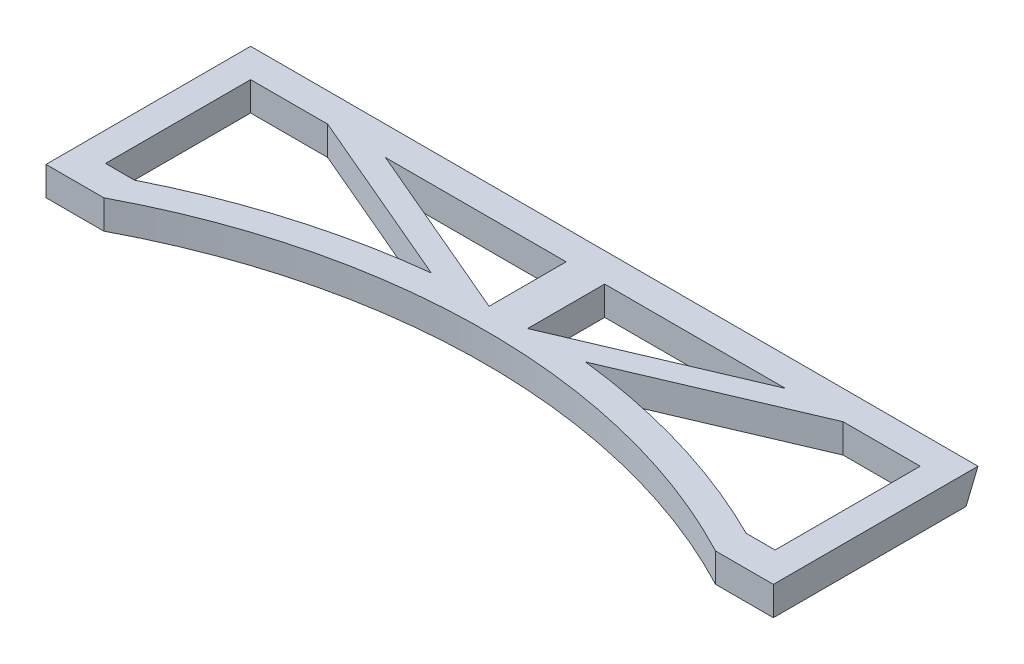
ISO-10303-21;
HEADER;
FILE_DESCRIPTION(('STEP AP214'),'2;1');
FILE_NAME('part.step','',(''),(''),'','','');
FILE_SCHEMA(('AUTOMOTIVE_DESIGN { 1 0 10303 214 1 1 1 1 }'));
ENDSEC;
DATA;
#1=APPLICATION_CONTEXT('core data for automotive mechanical design processes');
#2=APPLICATION_PROTOCOL_DEFINITION('international standard','automotive_design',2000,#1);
#3=PRODUCT_CONTEXT('',#1,'mechanical');
#4=PRODUCT('Part','Part','',(#3));
#5=PRODUCT_RELATED_PRODUCT_CATEGORY('part','',(#4));
#6=PRODUCT_DEFINITION_FORMATION('','',#4);
#7=PRODUCT_DEFINITION_CONTEXT('part definition',#1,'design');
#8=PRODUCT_DEFINITION('design','',#6,#7);
#9=PRODUCT_DEFINITION_SHAPE('','',#8);
#10=(LENGTH_UNIT() NAMED_UNIT(*) SI_UNIT(.MILLI.,.METRE.));
#11=(NAMED_UNIT(*) PLANE_ANGLE_UNIT() SI_UNIT($,.RADIAN.));
#12=(NAMED_UNIT(*) SI_UNIT($,.STERADIAN.) SOLID_ANGLE_UNIT());
#13=UNCERTAINTY_MEASURE_WITH_UNIT(LENGTH_MEASURE(1.E-05),#10,'distance_accuracy_value','');
#14=(GEOMETRIC_REPRESENTATION_CONTEXT(3) GLOBAL_UNCERTAINTY_ASSIGNED_CONTEXT((#13)) GLOBAL_UNIT_ASSIGNED_CONTEXT((#10,
#11,#12)) REPRESENTATION_CONTEXT('',''));
#15=CARTESIAN_POINT('',(0.,0.,0.));
#16=DIRECTION('',(0.,0.,1.));
#17=DIRECTION('',(1.,0.,0.));
#18=AXIS2_PLACEMENT_3D('',#15,#16,#17);
#19=CARTESIAN_POINT('',(0.,9.525,258.356061364937));
#20=DIRECTION('',(0.,-1.,0.));
#21=DIRECTION('',(0.,0.,-1.));
#22=AXIS2_PLACEMENT_3D('',#19,#20,#21);
#23=PLANE('',#22);
#24=DIRECTION('',(0.,0.,1.));
#25=VECTOR('',#24,1.);
#26=CARTESIAN_POINT('',(-119.85625,9.525,0.));
#27=LINE('',#26,#25);
#28=CARTESIAN_POINT('',(-119.85625,9.525,0.));
#29=VERTEX_POINT('',#28);
#30=CARTESIAN_POINT('',(-119.85625,9.525,67.43484735));
#31=VERTEX_POINT('',#30);
#32=EDGE_CURVE('E375',#29,#31,#27,.T.);
#33=ORIENTED_EDGE('',*,*,#32,.T.);
#34=DIRECTION('',(1.,0.,0.));
#35=VECTOR('',#34,1.);
#36=CARTESIAN_POINT('',(-119.85625,9.525,67.43484735));
#37=LINE('',#36,#35);
#38=CARTESIAN_POINT('',(-100.80625,9.525,67.43484735));
#39=VERTEX_POINT('',#38);
#40=EDGE_CURVE('E379',#31,#39,#37,.T.);
#41=ORIENTED_EDGE('',*,*,#40,.T.);
#42=CARTESIAN_POINT('',(0.,9.525,258.356061364937));
#43=DIRECTION('',(0.,-1.,0.));
#44=DIRECTION('',(0.,0.,-1.));
#45=AXIS2_PLACEMENT_3D('',#42,#43,#44);
#46=CIRCLE('',#45,215.9);
#47=CARTESIAN_POINT('',(100.80625,9.525,67.43484735));
#48=VERTEX_POINT('',#47);
#49=EDGE_CURVE('E383',#39,#48,#46,.T.);
#50=ORIENTED_EDGE('',*,*,#49,.T.);
#51=DIRECTION('',(1.,0.,0.));
#52=VECTOR('',#51,1.);
#53=CARTESIAN_POINT('',(119.85625,9.525,67.43484735));
#54=LINE('',#53,#52);
#55=CARTESIAN_POINT('',(119.85625,9.525,67.43484735));
#56=VERTEX_POINT('',#55);
#57=EDGE_CURVE('E386',#48,#56,#54,.T.);
#58=ORIENTED_EDGE('',*,*,#57,.T.);
#59=DIRECTION('',(0.,0.,-1.));
#60=VECTOR('',#59,1.);
#61=CARTESIAN_POINT('',(119.85625,9.525,0.));
#62=LINE('',#61,#60);
#63=CARTESIAN_POINT('',(119.85625,9.525,0.));
#64=VERTEX_POINT('',#63);
#65=EDGE_CURVE('E389',#56,#64,#62,.T.);
#66=ORIENTED_EDGE('',*,*,#65,.T.);
#67=DIRECTION('',(-1.,0.,0.));
#68=VECTOR('',#67,1.);
#69=CARTESIAN_POINT('',(-119.85625,9.525,0.));
#70=LINE('',#69,#68);
#71=EDGE_CURVE('E393',#64,#29,#70,.T.);
#72=ORIENTED_EDGE('',*,*,#71,.T.);
#73=EDGE_LOOP('',(#33,#41,#50,#58,#66,#72));
#74=FACE_BOUND('',#73,.T.);
#75=CARTESIAN_POINT('',(0.,9.525,258.356061364937));
#76=DIRECTION('',(0.,-1.,0.));
#77=DIRECTION('',(0.,0.,-1.));
#78=AXIS2_PLACEMENT_3D('',#75,#76,#77);
#79=CIRCLE('',#78,224.870182955994);
#80=CARTESIAN_POINT('',(-100.80625,9.525,57.3468597258087));
#81=VERTEX_POINT('',#80);
#82=CARTESIAN_POINT('',(-25.4,9.525,34.925));
#83=VERTEX_POINT('',#82);
#84=EDGE_CURVE('E344',#81,#83,#79,.T.);
#85=ORIENTED_EDGE('',*,*,#84,.F.);
#86=DIRECTION('',(1.,0.,0.));
#87=VECTOR('',#86,1.);
#88=CARTESIAN_POINT('',(-110.33125,9.525,57.3468597258086));
#89=LINE('',#88,#87);
#90=CARTESIAN_POINT('',(-110.33125,9.525,57.3468597258086));
#91=VERTEX_POINT('',#90);
#92=EDGE_CURVE('E274',#91,#81,#89,.T.);
#93=ORIENTED_EDGE('',*,*,#92,.F.);
#94=DIRECTION('',(0.,0.,1.));
#95=VECTOR('',#94,1.);
#96=CARTESIAN_POINT('',(-110.33125,9.525,57.3468597258086));
#97=LINE('',#96,#95);
#98=CARTESIAN_POINT('',(-110.33125,9.525,9.52499999999996));
#99=VERTEX_POINT('',#98);
#100=EDGE_CURVE('E325',#99,#91,#97,.T.);
#101=ORIENTED_EDGE('',*,*,#100,.F.);
#102=DIRECTION('',(-1.,0.,0.));
#103=VECTOR('',#102,1.);
#104=CARTESIAN_POINT('',(-110.33125,9.525,9.52499999999996));
#105=LINE('',#104,#103);
#106=CARTESIAN_POINT('',(-84.93125,9.525,9.52499999999996));
#107=VERTEX_POINT('',#106);
#108=EDGE_CURVE('E352',#107,#99,#105,.T.);
#109=ORIENTED_EDGE('',*,*,#108,.F.);
#110=DIRECTION('',(-0.919778168080743,0.,-0.392438685047784));
#111=VECTOR('',#110,1.);
#112=CARTESIAN_POINT('',(-84.93125,9.525,9.52499999999996));
#113=LINE('',#112,#111);
#114=EDGE_CURVE('E348',#83,#107,#113,.T.);
#115=ORIENTED_EDGE('',*,*,#114,.F.);
#116=EDGE_LOOP('',(#85,#93,#101,#109,#115));
#117=FACE_BOUND('',#116,.T.);
#118=DIRECTION('',(0.919778168080742,0.,-0.392438685047784));
#119=VECTOR('',#118,1.);
#120=CARTESIAN_POINT('',(65.88125,9.525,9.52499999999995));
#121=LINE('',#120,#119);
#122=CARTESIAN_POINT('',(6.35000000000001,9.525,34.925));
#123=VERTEX_POINT('',#122);
#124=CARTESIAN_POINT('',(65.88125,9.525,9.52499999999995));
#125=VERTEX_POINT('',#124);
#126=EDGE_CURVE('E217',#123,#125,#121,.T.);
#127=ORIENTED_EDGE('',*,*,#126,.F.);
#128=DIRECTION('',(0.,0.,1.));
#129=VECTOR('',#128,1.);
#130=CARTESIAN_POINT('',(6.35,9.525,34.925));
#131=LINE('',#130,#129);
#132=CARTESIAN_POINT('',(6.35,9.525,9.52499999999996));
#133=VERTEX_POINT('',#132);
#134=EDGE_CURVE('E200',#133,#123,#131,.T.);
#135=ORIENTED_EDGE('',*,*,#134,.F.);
#136=DIRECTION('',(-1.,0.,0.));
#137=VECTOR('',#136,1.);
#138=CARTESIAN_POINT('',(6.35,9.525,9.52499999999996));
#139=LINE('',#138,#137);
#140=EDGE_CURVE('E210',#125,#133,#139,.T.);
#141=ORIENTED_EDGE('',*,*,#140,.F.);
#142=EDGE_LOOP('',(#127,#135,#141));
#143=FACE_BOUND('',#142,.T.);
#144=DIRECTION('',(0.919778168080742,0.,0.392438685047783));
#145=VECTOR('',#144,1.);
#146=CARTESIAN_POINT('',(-65.88125,9.525,9.52499999999996));
#147=LINE('',#146,#145);
#148=CARTESIAN_POINT('',(-65.88125,9.525,9.52499999999996));
#149=VERTEX_POINT('',#148);
#150=CARTESIAN_POINT('',(-6.35,9.525,34.925));
#151=VERTEX_POINT('',#150);
#152=EDGE_CURVE('E303',#149,#151,#147,.T.);
#153=ORIENTED_EDGE('',*,*,#152,.F.);
#154=DIRECTION('',(-1.,0.,0.));
#155=VECTOR('',#154,1.);
#156=CARTESIAN_POINT('',(-6.34999999999999,9.525,9.52499999999996));
#157=LINE('',#156,#155);
#158=CARTESIAN_POINT('',(-6.34999999999999,9.525,9.52499999999996));
#159=VERTEX_POINT('',#158);
#160=EDGE_CURVE('E72',#159,#149,#157,.T.);
#161=ORIENTED_EDGE('',*,*,#160,.F.);
#162=DIRECTION('',(0.,0.,-1.));
#163=VECTOR('',#162,1.);
#164=CARTESIAN_POINT('',(-6.35,9.525,34.925));
#165=LINE('',#164,#163);
#166=EDGE_CURVE('E299',#151,#159,#165,.T.);
#167=ORIENTED_EDGE('',*,*,#166,.F.);
#168=EDGE_LOOP('',(#153,#161,#167));
#169=FACE_BOUND('',#168,.T.);
#170=DIRECTION('',(1.,0.,0.));
#171=VECTOR('',#170,1.);
#172=CARTESIAN_POINT('',(110.33125,9.525,57.3468597258086));
#173=LINE('',#172,#171);
#174=CARTESIAN_POINT('',(100.80625,9.525,57.3468597258086));
#175=VERTEX_POINT('',#174);
#176=CARTESIAN_POINT('',(110.33125,9.525,57.3468597258086));
#177=VERTEX_POINT('',#176);
#178=EDGE_CURVE('E268',#175,#177,#173,.T.);
#179=ORIENTED_EDGE('',*,*,#178,.F.);
#180=CARTESIAN_POINT('',(0.,9.525,258.356061364937));
#181=DIRECTION('',(0.,-1.,0.));
#182=DIRECTION('',(0.,0.,1.));
#183=AXIS2_PLACEMENT_3D('',#180,#181,#182);
#184=CIRCLE('',#183,224.870182955994);
#185=CARTESIAN_POINT('',(25.4,9.525,34.9249999999999));
#186=VERTEX_POINT('',#185);
#187=EDGE_CURVE('E64',#186,#175,#184,.T.);
#188=ORIENTED_EDGE('',*,*,#187,.F.);
#189=DIRECTION('',(-0.919778168080742,0.,0.392438685047784));
#190=VECTOR('',#189,1.);
#191=CARTESIAN_POINT('',(84.93125,9.525,9.52499999999994));
#192=LINE('',#191,#190);
#193=CARTESIAN_POINT('',(84.93125,9.525,9.52499999999994));
#194=VERTEX_POINT('',#193);
#195=EDGE_CURVE('E255',#194,#186,#192,.T.);
#196=ORIENTED_EDGE('',*,*,#195,.F.);
#197=DIRECTION('',(-1.,0.,0.));
#198=VECTOR('',#197,1.);
#199=CARTESIAN_POINT('',(110.33125,9.525,9.52499999999995));
#200=LINE('',#199,#198);
#201=CARTESIAN_POINT('',(110.33125,9.525,9.52499999999995));
#202=VERTEX_POINT('',#201);
#203=EDGE_CURVE('E259',#202,#194,#200,.T.);
#204=ORIENTED_EDGE('',*,*,#203,.F.);
#205=DIRECTION('',(0.,0.,-1.));
#206=VECTOR('',#205,1.);
#207=CARTESIAN_POINT('',(110.33125,9.525,57.3468597258086));
#208=LINE('',#207,#206);
#209=EDGE_CURVE('E264',#177,#202,#208,.T.);
#210=ORIENTED_EDGE('',*,*,#209,.F.);
#211=EDGE_LOOP('',(#179,#188,#196,#204,#210));
#212=FACE_BOUND('',#211,.T.);
#213=ADVANCED_FACE('F47',(#74,#117,#143,#169,#212),#23,.F.);
#214=CARTESIAN_POINT('',(0.,0.,258.356061364937));
#215=DIRECTION('',(0.,-1.,0.));
#216=DIRECTION('',(0.,0.,-1.));
#217=AXIS2_PLACEMENT_3D('',#214,#215,#216);
#218=PLANE('',#217);
#219=DIRECTION('',(-1.,0.,0.));
#220=VECTOR('',#219,1.);
#221=CARTESIAN_POINT('',(-6.34999999999999,0.,9.52499999999996));
#222=LINE('',#221,#220);
#223=CARTESIAN_POINT('',(-6.34999999999999,0.,9.52499999999996));
#224=VERTEX_POINT('',#223);
#225=CARTESIAN_POINT('',(-65.88125,0.,9.52499999999996));
#226=VERTEX_POINT('',#225);
#227=EDGE_CURVE('E304',#224,#226,#222,.T.);
#228=ORIENTED_EDGE('',*,*,#227,.T.);
#229=DIRECTION('',(0.919778168080742,0.,0.392438685047783));
#230=VECTOR('',#229,1.);
#231=CARTESIAN_POINT('',(-65.88125,0.,9.52499999999996));
#232=LINE('',#231,#230);
#233=CARTESIAN_POINT('',(-6.34999999999999,0.,34.9249999999999));
#234=VERTEX_POINT('',#233);
#235=EDGE_CURVE('E313',#226,#234,#232,.T.);
#236=ORIENTED_EDGE('',*,*,#235,.T.);
#237=DIRECTION('',(0.,0.,-1.));
#238=VECTOR('',#237,1.);
#239=CARTESIAN_POINT('',(-6.35,0.,34.925));
#240=LINE('',#239,#238);
#241=EDGE_CURVE('E296',#234,#224,#240,.T.);
#242=ORIENTED_EDGE('',*,*,#241,.T.);
#243=EDGE_LOOP('',(#228,#236,#242));
#244=FACE_BOUND('',#243,.T.);
#245=DIRECTION('',(1.,0.,0.));
#246=VECTOR('',#245,1.);
#247=CARTESIAN_POINT('',(-110.33125,0.,57.3468597258086));
#248=LINE('',#247,#246);
#249=CARTESIAN_POINT('',(-110.33125,0.,57.3468597258086));
#250=VERTEX_POINT('',#249);
#251=CARTESIAN_POINT('',(-100.80625,0.,57.3468597258087));
#252=VERTEX_POINT('',#251);
#253=EDGE_CURVE('E320',#250,#252,#248,.T.);
#254=ORIENTED_EDGE('',*,*,#253,.T.);
#255=CARTESIAN_POINT('',(0.,0.,258.356061364937));
#256=DIRECTION('',(0.,-1.,0.));
#257=DIRECTION('',(0.,0.,-1.));
#258=AXIS2_PLACEMENT_3D('',#255,#256,#257);
#259=CIRCLE('',#258,224.870182955994);
#260=CARTESIAN_POINT('',(-25.4,0.,34.925));
#261=VERTEX_POINT('',#260);
#262=EDGE_CURVE('E324',#252,#261,#259,.T.);
#263=ORIENTED_EDGE('',*,*,#262,.T.);
#264=DIRECTION('',(-0.919778168080743,0.,-0.392438685047784));
#265=VECTOR('',#264,1.);
#266=CARTESIAN_POINT('',(-84.93125,0.,9.52499999999996));
#267=LINE('',#266,#265);
#268=CARTESIAN_POINT('',(-84.93125,0.,9.52499999999996));
#269=VERTEX_POINT('',#268);
#270=EDGE_CURVE('E329',#261,#269,#267,.T.);
#271=ORIENTED_EDGE('',*,*,#270,.T.);
#272=DIRECTION('',(-1.,0.,0.));
#273=VECTOR('',#272,1.);
#274=CARTESIAN_POINT('',(-110.33125,0.,9.52499999999996));
#275=LINE('',#274,#273);
#276=CARTESIAN_POINT('',(-110.33125,0.,9.52499999999996));
#277=VERTEX_POINT('',#276);
#278=EDGE_CURVE('E333',#269,#277,#275,.T.);
#279=ORIENTED_EDGE('',*,*,#278,.T.);
#280=DIRECTION('',(0.,0.,1.));
#281=VECTOR('',#280,1.);
#282=CARTESIAN_POINT('',(-110.33125,0.,57.3468597258086));
#283=LINE('',#282,#281);
#284=EDGE_CURVE('E337',#277,#250,#283,.T.);
#285=ORIENTED_EDGE('',*,*,#284,.T.);
#286=EDGE_LOOP('',(#254,#263,#271,#279,#285));
#287=FACE_BOUND('',#286,.T.);
#288=DIRECTION('',(0.,0.,1.));
#289=VECTOR('',#288,1.);
#290=CARTESIAN_POINT('',(-119.85625,0.,0.));
#291=LINE('',#290,#289);
#292=CARTESIAN_POINT('',(-119.85625,0.,3.93484735000001));
#293=VERTEX_POINT('',#292);
#294=CARTESIAN_POINT('',(-119.85625,0.,67.43484735));
#295=VERTEX_POINT('',#294);
#296=EDGE_CURVE('E362',#293,#295,#291,.T.);
#297=ORIENTED_EDGE('',*,*,#296,.F.);
#298=DIRECTION('',(1.,0.,0.));
#299=VECTOR('',#298,1.);
#300=CARTESIAN_POINT('',(119.85625,0.,3.93484734999997));
#301=LINE('',#300,#299);
#302=CARTESIAN_POINT('',(119.85625,0.,3.93484734999997));
#303=VERTEX_POINT('',#302);
#304=EDGE_CURVE('E57',#293,#303,#301,.T.);
#305=ORIENTED_EDGE('',*,*,#304,.T.);
#306=DIRECTION('',(0.,0.,-1.));
#307=VECTOR('',#306,1.);
#308=CARTESIAN_POINT('',(119.85625,0.,0.));
#309=LINE('',#308,#307);
#310=CARTESIAN_POINT('',(119.85625,0.,67.43484735));
#311=VERTEX_POINT('',#310);
#312=EDGE_CURVE('E380',#311,#303,#309,.T.);
#313=ORIENTED_EDGE('',*,*,#312,.F.);
#314=DIRECTION('',(1.,0.,0.));
#315=VECTOR('',#314,1.);
#316=CARTESIAN_POINT('',(119.85625,0.,67.43484735));
#317=LINE('',#316,#315);
#318=CARTESIAN_POINT('',(100.80625,0.,67.43484735));
#319=VERTEX_POINT('',#318);
#320=EDGE_CURVE('E406',#319,#311,#317,.T.);
#321=ORIENTED_EDGE('',*,*,#320,.F.);
#322=CARTESIAN_POINT('',(0.,0.,258.356061364937));
#323=DIRECTION('',(0.,-1.,0.));
#324=DIRECTION('',(0.,0.,-1.));
#325=AXIS2_PLACEMENT_3D('',#322,#323,#324);
#326=CIRCLE('',#325,215.9);
#327=CARTESIAN_POINT('',(-100.80625,0.,67.43484735));
#328=VERTEX_POINT('',#327);
#329=EDGE_CURVE('E403',#328,#319,#326,.T.);
#330=ORIENTED_EDGE('',*,*,#329,.F.);
#331=DIRECTION('',(1.,0.,0.));
#332=VECTOR('',#331,1.);
#333=CARTESIAN_POINT('',(-119.85625,0.,67.43484735));
#334=LINE('',#333,#332);
#335=EDGE_CURVE('E400',#295,#328,#334,.T.);
#336=ORIENTED_EDGE('',*,*,#335,.F.);
#337=EDGE_LOOP('',(#297,#305,#313,#321,#330,#336));
#338=FACE_BOUND('',#337,.T.);
#339=DIRECTION('',(0.,0.,1.));
#340=VECTOR('',#339,1.);
#341=CARTESIAN_POINT('',(6.35,0.,34.925));
#342=LINE('',#341,#340);
#343=CARTESIAN_POINT('',(6.35,0.,9.52499999999996));
#344=VERTEX_POINT('',#343);
#345=CARTESIAN_POINT('',(6.35,0.,34.925));
#346=VERTEX_POINT('',#345);
#347=EDGE_CURVE('E203',#344,#346,#342,.T.);
#348=ORIENTED_EDGE('',*,*,#347,.T.);
#349=DIRECTION('',(0.919778168080742,0.,-0.392438685047784));
#350=VECTOR('',#349,1.);
#351=CARTESIAN_POINT('',(65.88125,0.,9.52499999999995));
#352=LINE('',#351,#350);
#353=CARTESIAN_POINT('',(65.88125,0.,9.52499999999996));
#354=VERTEX_POINT('',#353);
#355=EDGE_CURVE('E232',#346,#354,#352,.T.);
#356=ORIENTED_EDGE('',*,*,#355,.T.);
#357=DIRECTION('',(-1.,0.,0.));
#358=VECTOR('',#357,1.);
#359=CARTESIAN_POINT('',(6.35,0.,9.52499999999996));
#360=LINE('',#359,#358);
#361=EDGE_CURVE('E229',#354,#344,#360,.T.);
#362=ORIENTED_EDGE('',*,*,#361,.T.);
#363=EDGE_LOOP('',(#348,#356,#362));
#364=FACE_BOUND('',#363,.T.);
#365=CARTESIAN_POINT('',(0.,0.,258.356061364937));
#366=DIRECTION('',(0.,-1.,0.));
#367=DIRECTION('',(0.,0.,1.));
#368=AXIS2_PLACEMENT_3D('',#365,#366,#367);
#369=CIRCLE('',#368,224.870182955994);
#370=CARTESIAN_POINT('',(25.4,0.,34.9249999999999));
#371=VERTEX_POINT('',#370);
#372=CARTESIAN_POINT('',(100.80625,0.,57.3468597258086));
#373=VERTEX_POINT('',#372);
#374=EDGE_CURVE('E260',#371,#373,#369,.T.);
#375=ORIENTED_EDGE('',*,*,#374,.T.);
#376=DIRECTION('',(1.,0.,0.));
#377=VECTOR('',#376,1.);
#378=CARTESIAN_POINT('',(110.33125,0.,57.3468597258086));
#379=LINE('',#378,#377);
#380=CARTESIAN_POINT('',(110.33125,0.,57.3468597258086));
#381=VERTEX_POINT('',#380);
#382=EDGE_CURVE('E286',#373,#381,#379,.T.);
#383=ORIENTED_EDGE('',*,*,#382,.T.);
#384=DIRECTION('',(0.,0.,-1.));
#385=VECTOR('',#384,1.);
#386=CARTESIAN_POINT('',(110.33125,0.,57.3468597258086));
#387=LINE('',#386,#385);
#388=CARTESIAN_POINT('',(110.33125,0.,9.52499999999995));
#389=VERTEX_POINT('',#388);
#390=EDGE_CURVE('E282',#381,#389,#387,.T.);
#391=ORIENTED_EDGE('',*,*,#390,.T.);
#392=DIRECTION('',(-1.,0.,0.));
#393=VECTOR('',#392,1.);
#394=CARTESIAN_POINT('',(110.33125,0.,9.52499999999995));
#395=LINE('',#394,#393);
#396=CARTESIAN_POINT('',(84.93125,0.,9.52499999999994));
#397=VERTEX_POINT('',#396);
#398=EDGE_CURVE('E278',#389,#397,#395,.T.);
#399=ORIENTED_EDGE('',*,*,#398,.T.);
#400=DIRECTION('',(-0.919778168080742,0.,0.392438685047784));
#401=VECTOR('',#400,1.);
#402=CARTESIAN_POINT('',(84.93125,0.,9.52499999999994));
#403=LINE('',#402,#401);
#404=EDGE_CURVE('E242',#397,#371,#403,.T.);
#405=ORIENTED_EDGE('',*,*,#404,.T.);
#406=EDGE_LOOP('',(#375,#383,#391,#399,#405));
#407=FACE_BOUND('',#406,.T.);
#408=ADVANCED_FACE('F434',(#244,#287,#338,#364,#407),#218,.T.);
#409=CARTESIAN_POINT('',(-119.85625,9.525,0.));
#410=DIRECTION('',(1.,0.,0.));
#411=DIRECTION('',(0.,0.,-1.));
#412=AXIS2_PLACEMENT_3D('',#409,#410,#411);
#413=PLANE('',#412);
#414=ORIENTED_EDGE('',*,*,#32,.F.);
#415=DIRECTION('',(0.,-0.924240601032716,0.38181057005102));
#416=VECTOR('',#415,1.);
#417=CARTESIAN_POINT('',(-119.85625,9.52500000000009,0.));
#418=LINE('',#417,#416);
#419=EDGE_CURVE('E427',#29,#293,#418,.T.);
#420=ORIENTED_EDGE('',*,*,#419,.T.);
#421=ORIENTED_EDGE('',*,*,#296,.T.);
#422=DIRECTION('',(0.,-1.,0.));
#423=VECTOR('',#422,1.);
#424=CARTESIAN_POINT('',(-119.85625,9.525,67.43484735));
#425=LINE('',#424,#423);
#426=EDGE_CURVE('E423',#31,#295,#425,.T.);
#427=ORIENTED_EDGE('',*,*,#426,.F.);
#428=EDGE_LOOP('',(#414,#420,#421,#427));
#429=FACE_BOUND('',#428,.T.);
#430=ADVANCED_FACE('F450',(#429),#413,.F.);
#431=CARTESIAN_POINT('',(-119.85625,9.525,67.43484735));
#432=DIRECTION('',(0.,0.,-1.));
#433=DIRECTION('',(-1.,0.,0.));
#434=AXIS2_PLACEMENT_3D('',#431,#432,#433);
#435=PLANE('',#434);
#436=ORIENTED_EDGE('',*,*,#335,.T.);
#437=DIRECTION('',(0.,-1.,0.));
#438=VECTOR('',#437,1.);
#439=CARTESIAN_POINT('',(-100.80625,9.525,67.43484735));
#440=LINE('',#439,#438);
#441=EDGE_CURVE('E419',#39,#328,#440,.T.);
#442=ORIENTED_EDGE('',*,*,#441,.F.);
#443=ORIENTED_EDGE('',*,*,#40,.F.);
#444=ORIENTED_EDGE('',*,*,#426,.T.);
#445=EDGE_LOOP('',(#436,#442,#443,#444));
#446=FACE_BOUND('',#445,.T.);
#447=ADVANCED_FACE('F452',(#446),#435,.F.);
#448=CARTESIAN_POINT('',(0.,9.525,258.356061364937));
#449=DIRECTION('',(0.,-1.,0.));
#450=DIRECTION('',(0.,0.,-1.));
#451=AXIS2_PLACEMENT_3D('',#448,#449,#450);
#452=CYLINDRICAL_SURFACE('',#451,215.9);
#453=ORIENTED_EDGE('',*,*,#329,.T.);
#454=DIRECTION('',(0.,-1.,0.));
#455=VECTOR('',#454,1.);
#456=CARTESIAN_POINT('',(100.80625,9.525,67.43484735));
#457=LINE('',#456,#455);
#458=EDGE_CURVE('E415',#48,#319,#457,.T.);
#459=ORIENTED_EDGE('',*,*,#458,.F.);
#460=ORIENTED_EDGE('',*,*,#49,.F.);
#461=ORIENTED_EDGE('',*,*,#441,.T.);
#462=EDGE_LOOP('',(#453,#459,#460,#461));
#463=FACE_BOUND('',#462,.T.);
#464=ADVANCED_FACE('F458',(#463),#452,.F.);
#465=CARTESIAN_POINT('',(119.85625,9.525,67.43484735));
#466=DIRECTION('',(0.,0.,-1.));
#467=DIRECTION('',(-1.,0.,0.));
#468=AXIS2_PLACEMENT_3D('',#465,#466,#467);
#469=PLANE('',#468);
#470=ORIENTED_EDGE('',*,*,#320,.T.);
#471=DIRECTION('',(0.,-1.,0.));
#472=VECTOR('',#471,1.);
#473=CARTESIAN_POINT('',(119.85625,9.525,67.43484735));
#474=LINE('',#473,#472);
#475=EDGE_CURVE('E397',#56,#311,#474,.T.);
#476=ORIENTED_EDGE('',*,*,#475,.F.);
#477=ORIENTED_EDGE('',*,*,#57,.F.);
#478=ORIENTED_EDGE('',*,*,#458,.T.);
#479=EDGE_LOOP('',(#470,#476,#477,#478));
#480=FACE_BOUND('',#479,.T.);
#481=ADVANCED_FACE('F461',(#480),#469,.F.);
#482=CARTESIAN_POINT('',(119.85625,9.525,0.));
#483=DIRECTION('',(-1.,0.,0.));
#484=DIRECTION('',(0.,0.,1.));
#485=AXIS2_PLACEMENT_3D('',#482,#483,#484);
#486=PLANE('',#485);
#487=ORIENTED_EDGE('',*,*,#312,.T.);
#488=DIRECTION('',(0.,0.924240601032716,-0.38181057005102));
#489=VECTOR('',#488,1.);
#490=CARTESIAN_POINT('',(119.85625,9.52500000000009,0.));
#491=LINE('',#490,#489);
#492=EDGE_CURVE('E11',#303,#64,#491,.T.);
#493=ORIENTED_EDGE('',*,*,#492,.T.);
#494=ORIENTED_EDGE('',*,*,#65,.F.);
#495=ORIENTED_EDGE('',*,*,#475,.T.);
#496=EDGE_LOOP('',(#487,#493,#494,#495));
#497=FACE_BOUND('',#496,.T.);
#498=ADVANCED_FACE('F441',(#497),#486,.F.);
#499=CARTESIAN_POINT('',(-119.85625,9.52500000000009,0.));
#500=DIRECTION('',(0.,-0.38181057005102,-0.924240601032715));
#501=DIRECTION('',(1.,0.,0.));
#502=AXIS2_PLACEMENT_3D('',#499,#500,#501);
#503=PLANE('',#502);
#504=ORIENTED_EDGE('',*,*,#492,.F.);
#505=ORIENTED_EDGE('',*,*,#304,.F.);
#506=ORIENTED_EDGE('',*,*,#419,.F.);
#507=ORIENTED_EDGE('',*,*,#71,.F.);
#508=EDGE_LOOP('',(#504,#505,#506,#507));
#509=FACE_BOUND('',#508,.T.);
#510=ADVANCED_FACE('F50',(#509),#503,.T.);
#511=CARTESIAN_POINT('',(-110.33125,0.,57.3468597258086));
#512=DIRECTION('',(0.,0.,1.));
#513=DIRECTION('',(1.,0.,0.));
#514=AXIS2_PLACEMENT_3D('',#511,#512,#513);
#515=PLANE('',#514);
#516=ORIENTED_EDGE('',*,*,#92,.T.);
#517=DIRECTION('',(0.,1.,0.));
#518=VECTOR('',#517,1.);
#519=CARTESIAN_POINT('',(-100.80625,0.,57.3468597258087));
#520=LINE('',#519,#518);
#521=EDGE_CURVE('E341',#252,#81,#520,.T.);
#522=ORIENTED_EDGE('',*,*,#521,.F.);
#523=ORIENTED_EDGE('',*,*,#253,.F.);
#524=DIRECTION('',(0.,1.,0.));
#525=VECTOR('',#524,1.);
#526=CARTESIAN_POINT('',(-110.33125,0.,57.3468597258086));
#527=LINE('',#526,#525);
#528=EDGE_CURVE('E359',#250,#91,#527,.T.);
#529=ORIENTED_EDGE('',*,*,#528,.T.);
#530=EDGE_LOOP('',(#516,#522,#523,#529));
#531=FACE_BOUND('',#530,.T.);
#532=ADVANCED_FACE('F480',(#531),#515,.F.);
#533=CARTESIAN_POINT('',(-110.33125,0.,57.3468597258086));
#534=DIRECTION('',(-1.,0.,0.));
#535=DIRECTION('',(0.,0.,1.));
#536=AXIS2_PLACEMENT_3D('',#533,#534,#535);
#537=PLANE('',#536);
#538=ORIENTED_EDGE('',*,*,#100,.T.);
#539=ORIENTED_EDGE('',*,*,#528,.F.);
#540=ORIENTED_EDGE('',*,*,#284,.F.);
#541=DIRECTION('',(0.,1.,0.));
#542=VECTOR('',#541,1.);
#543=CARTESIAN_POINT('',(-110.33125,0.,9.52499999999996));
#544=LINE('',#543,#542);
#545=EDGE_CURVE('E363',#277,#99,#544,.T.);
#546=ORIENTED_EDGE('',*,*,#545,.T.);
#547=EDGE_LOOP('',(#538,#539,#540,#546));
#548=FACE_BOUND('',#547,.T.);
#549=ADVANCED_FACE('F483',(#548),#537,.F.);
#550=CARTESIAN_POINT('',(-110.33125,0.,9.52499999999996));
#551=DIRECTION('',(0.,0.,-1.));
#552=DIRECTION('',(-1.,0.,0.));
#553=AXIS2_PLACEMENT_3D('',#550,#551,#552);
#554=PLANE('',#553);
#555=ORIENTED_EDGE('',*,*,#108,.T.);
#556=ORIENTED_EDGE('',*,*,#545,.F.);
#557=ORIENTED_EDGE('',*,*,#278,.F.);
#558=DIRECTION('',(0.,1.,0.));
#559=VECTOR('',#558,1.);
#560=CARTESIAN_POINT('',(-84.93125,0.,9.52499999999996));
#561=LINE('',#560,#559);
#562=EDGE_CURVE('E366',#269,#107,#561,.T.);
#563=ORIENTED_EDGE('',*,*,#562,.T.);
#564=EDGE_LOOP('',(#555,#556,#557,#563));
#565=FACE_BOUND('',#564,.T.);
#566=ADVANCED_FACE('F492',(#565),#554,.F.);
#567=CARTESIAN_POINT('',(-84.93125,0.,9.52499999999996));
#568=DIRECTION('',(0.392438685047784,0.,-0.919778168080742));
#569=DIRECTION('',(-0.919778168080743,0.,-0.392438685047784));
#570=AXIS2_PLACEMENT_3D('',#567,#568,#569);
#571=PLANE('',#570);
#572=ORIENTED_EDGE('',*,*,#114,.T.);
#573=ORIENTED_EDGE('',*,*,#562,.F.);
#574=ORIENTED_EDGE('',*,*,#270,.F.);
#575=DIRECTION('',(0.,1.,0.));
#576=VECTOR('',#575,1.);
#577=CARTESIAN_POINT('',(-25.4,0.,34.925));
#578=LINE('',#577,#576);
#579=EDGE_CURVE('E369',#261,#83,#578,.T.);
#580=ORIENTED_EDGE('',*,*,#579,.T.);
#581=EDGE_LOOP('',(#572,#573,#574,#580));
#582=FACE_BOUND('',#581,.T.);
#583=ADVANCED_FACE('F488',(#582),#571,.F.);
#584=CARTESIAN_POINT('',(0.,0.,258.356061364937));
#585=DIRECTION('',(0.,1.,0.));
#586=DIRECTION('',(0.,0.,1.));
#587=AXIS2_PLACEMENT_3D('',#584,#585,#586);
#588=CYLINDRICAL_SURFACE('',#587,224.870182955994);
#589=ORIENTED_EDGE('',*,*,#84,.T.);
#590=ORIENTED_EDGE('',*,*,#579,.F.);
#591=ORIENTED_EDGE('',*,*,#262,.F.);
#592=ORIENTED_EDGE('',*,*,#521,.T.);
#593=EDGE_LOOP('',(#589,#590,#591,#592));
#594=FACE_BOUND('',#593,.T.);
#595=ADVANCED_FACE('F485',(#594),#588,.T.);
#596=CARTESIAN_POINT('',(6.35,0.,34.925));
#597=DIRECTION('',(-1.,0.,0.));
#598=DIRECTION('',(0.,0.,1.));
#599=AXIS2_PLACEMENT_3D('',#596,#597,#598);
#600=PLANE('',#599);
#601=ORIENTED_EDGE('',*,*,#134,.T.);
#602=DIRECTION('',(0.,1.,0.));
#603=VECTOR('',#602,1.);
#604=CARTESIAN_POINT('',(6.35,0.,34.925));
#605=LINE('',#604,#603);
#606=EDGE_CURVE('E233',#346,#123,#605,.T.);
#607=ORIENTED_EDGE('',*,*,#606,.F.);
#608=ORIENTED_EDGE('',*,*,#347,.F.);
#609=DIRECTION('',(0.,1.,0.));
#610=VECTOR('',#609,1.);
#611=CARTESIAN_POINT('',(6.35,0.,9.52499999999996));
#612=LINE('',#611,#610);
#613=EDGE_CURVE('E196',#344,#133,#612,.T.);
#614=ORIENTED_EDGE('',*,*,#613,.T.);
#615=EDGE_LOOP('',(#601,#607,#608,#614));
#616=FACE_BOUND('',#615,.T.);
#617=ADVANCED_FACE('F198',(#616),#600,.F.);
#618=CARTESIAN_POINT('',(6.35,0.,9.52499999999996));
#619=DIRECTION('',(0.,0.,-1.));
#620=DIRECTION('',(-1.,0.,0.));
#621=AXIS2_PLACEMENT_3D('',#618,#619,#620);
#622=PLANE('',#621);
#623=ORIENTED_EDGE('',*,*,#140,.T.);
#624=ORIENTED_EDGE('',*,*,#613,.F.);
#625=ORIENTED_EDGE('',*,*,#361,.F.);
#626=DIRECTION('',(0.,1.,0.));
#627=VECTOR('',#626,1.);
#628=CARTESIAN_POINT('',(65.88125,0.,9.52499999999995));
#629=LINE('',#628,#627);
#630=EDGE_CURVE('E207',#354,#125,#629,.T.);
#631=ORIENTED_EDGE('',*,*,#630,.T.);
#632=EDGE_LOOP('',(#623,#624,#625,#631));
#633=FACE_BOUND('',#632,.T.);
#634=ADVANCED_FACE('F211',(#633),#622,.F.);
#635=CARTESIAN_POINT('',(65.88125,0.,9.52499999999995));
#636=DIRECTION('',(0.392438685047784,0.,0.919778168080743));
#637=DIRECTION('',(0.919778168080743,0.,-0.392438685047784));
#638=AXIS2_PLACEMENT_3D('',#635,#636,#637);
#639=PLANE('',#638);
#640=ORIENTED_EDGE('',*,*,#126,.T.);
#641=ORIENTED_EDGE('',*,*,#630,.F.);
#642=ORIENTED_EDGE('',*,*,#355,.F.);
#643=ORIENTED_EDGE('',*,*,#606,.T.);
#644=EDGE_LOOP('',(#640,#641,#642,#643));
#645=FACE_BOUND('',#644,.T.);
#646=ADVANCED_FACE('F512',(#645),#639,.F.);
#647=CARTESIAN_POINT('',(-6.34999999999999,0.,9.52499999999996));
#648=DIRECTION('',(0.,0.,-1.));
#649=DIRECTION('',(-1.,0.,0.));
#650=AXIS2_PLACEMENT_3D('',#647,#648,#649);
#651=PLANE('',#650);
#652=ORIENTED_EDGE('',*,*,#160,.T.);
#653=DIRECTION('',(0.,1.,0.));
#654=VECTOR('',#653,1.);
#655=CARTESIAN_POINT('',(-65.88125,0.,9.52499999999996));
#656=LINE('',#655,#654);
#657=EDGE_CURVE('E293',#226,#149,#656,.T.);
#658=ORIENTED_EDGE('',*,*,#657,.F.);
#659=ORIENTED_EDGE('',*,*,#227,.F.);
#660=DIRECTION('',(0.,1.,0.));
#661=VECTOR('',#660,1.);
#662=CARTESIAN_POINT('',(-6.34999999999999,0.,9.52499999999996));
#663=LINE('',#662,#661);
#664=EDGE_CURVE('E221',#224,#159,#663,.T.);
#665=ORIENTED_EDGE('',*,*,#664,.T.);
#666=EDGE_LOOP('',(#652,#658,#659,#665));
#667=FACE_BOUND('',#666,.T.);
#668=ADVANCED_FACE('F504',(#667),#651,.F.);
#669=CARTESIAN_POINT('',(-6.35,0.,34.925));
#670=DIRECTION('',(1.,0.,0.));
#671=DIRECTION('',(0.,0.,-1.));
#672=AXIS2_PLACEMENT_3D('',#669,#670,#671);
#673=PLANE('',#672);
#674=ORIENTED_EDGE('',*,*,#166,.T.);
#675=ORIENTED_EDGE('',*,*,#664,.F.);
#676=ORIENTED_EDGE('',*,*,#241,.F.);
#677=DIRECTION('',(0.,1.,0.));
#678=VECTOR('',#677,1.);
#679=CARTESIAN_POINT('',(-6.35,0.,34.925));
#680=LINE('',#679,#678);
#681=EDGE_CURVE('E225',#234,#151,#680,.T.);
#682=ORIENTED_EDGE('',*,*,#681,.T.);
#683=EDGE_LOOP('',(#674,#675,#676,#682));
#684=FACE_BOUND('',#683,.T.);
#685=ADVANCED_FACE('F500',(#684),#673,.F.);
#686=CARTESIAN_POINT('',(-65.88125,0.,9.52499999999996));
#687=DIRECTION('',(-0.392438685047784,0.,0.919778168080743));
#688=DIRECTION('',(0.919778168080743,0.,0.392438685047784));
#689=AXIS2_PLACEMENT_3D('',#686,#687,#688);
#690=PLANE('',#689);
#691=ORIENTED_EDGE('',*,*,#152,.T.);
#692=ORIENTED_EDGE('',*,*,#681,.F.);
#693=ORIENTED_EDGE('',*,*,#235,.F.);
#694=ORIENTED_EDGE('',*,*,#657,.T.);
#695=EDGE_LOOP('',(#691,#692,#693,#694));
#696=FACE_BOUND('',#695,.T.);
#697=ADVANCED_FACE('F503',(#696),#690,.F.);
#698=CARTESIAN_POINT('',(0.,0.,258.356061364937));
#699=DIRECTION('',(0.,1.,0.));
#700=DIRECTION('',(0.,0.,1.));
#701=AXIS2_PLACEMENT_3D('',#698,#699,#700);
#702=CYLINDRICAL_SURFACE('',#701,224.870182955994);
#703=ORIENTED_EDGE('',*,*,#187,.T.);
#704=DIRECTION('',(0.,1.,0.));
#705=VECTOR('',#704,1.);
#706=CARTESIAN_POINT('',(100.80625,0.,57.3468597258086));
#707=LINE('',#706,#705);
#708=EDGE_CURVE('E239',#373,#175,#707,.T.);
#709=ORIENTED_EDGE('',*,*,#708,.F.);
#710=ORIENTED_EDGE('',*,*,#374,.F.);
#711=DIRECTION('',(0.,1.,0.));
#712=VECTOR('',#711,1.);
#713=CARTESIAN_POINT('',(25.4,0.,34.9249999999999));
#714=LINE('',#713,#712);
#715=EDGE_CURVE('E252',#371,#186,#714,.T.);
#716=ORIENTED_EDGE('',*,*,#715,.T.);
#717=EDGE_LOOP('',(#703,#709,#710,#716));
#718=FACE_BOUND('',#717,.T.);
#719=ADVANCED_FACE('F508',(#718),#702,.T.);
#720=CARTESIAN_POINT('',(84.93125,0.,9.52499999999994));
#721=DIRECTION('',(-0.392438685047784,0.,-0.919778168080742));
#722=DIRECTION('',(-0.919778168080743,0.,0.392438685047784));
#723=AXIS2_PLACEMENT_3D('',#720,#721,#722);
#724=PLANE('',#723);
#725=ORIENTED_EDGE('',*,*,#195,.T.);
#726=ORIENTED_EDGE('',*,*,#715,.F.);
#727=ORIENTED_EDGE('',*,*,#404,.F.);
#728=DIRECTION('',(0.,1.,0.));
#729=VECTOR('',#728,1.);
#730=CARTESIAN_POINT('',(84.93125,0.,9.52499999999994));
#731=LINE('',#730,#729);
#732=EDGE_CURVE('E249',#397,#194,#731,.T.);
#733=ORIENTED_EDGE('',*,*,#732,.T.);
#734=EDGE_LOOP('',(#725,#726,#727,#733));
#735=FACE_BOUND('',#734,.T.);
#736=ADVANCED_FACE('F513',(#735),#724,.F.);
#737=CARTESIAN_POINT('',(110.33125,0.,9.52499999999995));
#738=DIRECTION('',(0.,0.,-1.));
#739=DIRECTION('',(-1.,0.,0.));
#740=AXIS2_PLACEMENT_3D('',#737,#738,#739);
#741=PLANE('',#740);
#742=ORIENTED_EDGE('',*,*,#203,.T.);
#743=ORIENTED_EDGE('',*,*,#732,.F.);
#744=ORIENTED_EDGE('',*,*,#398,.F.);
#745=DIRECTION('',(0.,1.,0.));
#746=VECTOR('',#745,1.);
#747=CARTESIAN_POINT('',(110.33125,0.,9.52499999999995));
#748=LINE('',#747,#746);
#749=EDGE_CURVE('E246',#389,#202,#748,.T.);
#750=ORIENTED_EDGE('',*,*,#749,.T.);
#751=EDGE_LOOP('',(#742,#743,#744,#750));
#752=FACE_BOUND('',#751,.T.);
#753=ADVANCED_FACE('F516',(#752),#741,.F.);
#754=CARTESIAN_POINT('',(110.33125,0.,57.3468597258086));
#755=DIRECTION('',(1.,0.,0.));
#756=DIRECTION('',(0.,0.,-1.));
#757=AXIS2_PLACEMENT_3D('',#754,#755,#756);
#758=PLANE('',#757);
#759=ORIENTED_EDGE('',*,*,#209,.T.);
#760=ORIENTED_EDGE('',*,*,#749,.F.);
#761=ORIENTED_EDGE('',*,*,#390,.F.);
#762=DIRECTION('',(0.,1.,0.));
#763=VECTOR('',#762,1.);
#764=CARTESIAN_POINT('',(110.33125,0.,57.3468597258086));
#765=LINE('',#764,#763);
#766=EDGE_CURVE('E243',#381,#177,#765,.T.);
#767=ORIENTED_EDGE('',*,*,#766,.T.);
#768=EDGE_LOOP('',(#759,#760,#761,#767));
#769=FACE_BOUND('',#768,.T.);
#770=ADVANCED_FACE('F520',(#769),#758,.F.);
#771=CARTESIAN_POINT('',(110.33125,0.,57.3468597258086));
#772=DIRECTION('',(0.,0.,1.));
#773=DIRECTION('',(1.,0.,0.));
#774=AXIS2_PLACEMENT_3D('',#771,#772,#773);
#775=PLANE('',#774);
#776=ORIENTED_EDGE('',*,*,#178,.T.);
#777=ORIENTED_EDGE('',*,*,#766,.F.);
#778=ORIENTED_EDGE('',*,*,#382,.F.);
#779=ORIENTED_EDGE('',*,*,#708,.T.);
#780=EDGE_LOOP('',(#776,#777,#778,#779));
#781=FACE_BOUND('',#780,.T.);
#782=ADVANCED_FACE('F524',(#781),#775,.F.);
#783=CLOSED_SHELL('',(#213,#408,#430,#447,#464,#481,#498,#510,#532,#549,#566,#583,#595,#617,
#634,#646,#668,#685,#697,#719,#736,#753,#770,#782));
#784=MANIFOLD_SOLID_BREP('B2',#783);
#785=ADVANCED_BREP_SHAPE_REPRESENTATION('',(#18,#784),#14);
#786=SHAPE_DEFINITION_REPRESENTATION(#9,#785);
ENDSEC;
END-ISO-10303-21;
